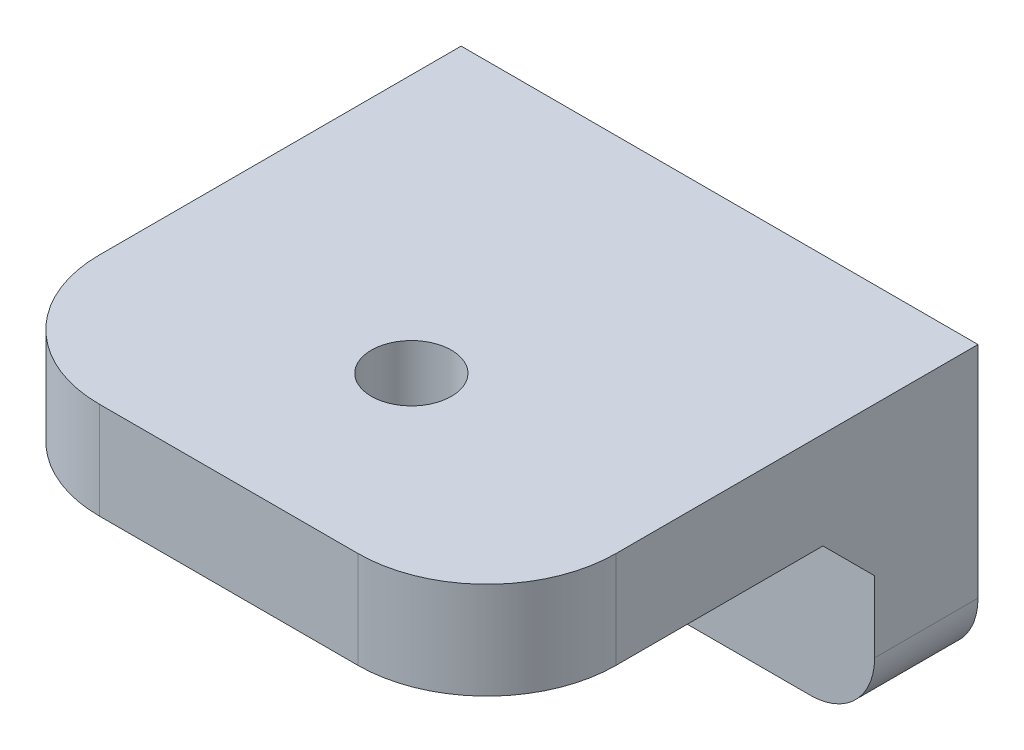
ISO-10303-21;
HEADER;
FILE_DESCRIPTION(('STEP AP214'),'2;1');
FILE_NAME('part.step','',(''),(''),'','','');
FILE_SCHEMA(('AUTOMOTIVE_DESIGN { 1 0 10303 214 1 1 1 1 }'));
ENDSEC;
DATA;
#1=APPLICATION_CONTEXT('core data for automotive mechanical design processes');
#2=APPLICATION_PROTOCOL_DEFINITION('international standard','automotive_design',2000,#1);
#3=PRODUCT_CONTEXT('',#1,'mechanical');
#4=PRODUCT('Part','Part','',(#3));
#5=PRODUCT_RELATED_PRODUCT_CATEGORY('part','',(#4));
#6=PRODUCT_DEFINITION_FORMATION('','',#4);
#7=PRODUCT_DEFINITION_CONTEXT('part definition',#1,'design');
#8=PRODUCT_DEFINITION('design','',#6,#7);
#9=PRODUCT_DEFINITION_SHAPE('','',#8);
#10=(LENGTH_UNIT() NAMED_UNIT(*) SI_UNIT(.MILLI.,.METRE.));
#11=(NAMED_UNIT(*) PLANE_ANGLE_UNIT() SI_UNIT($,.RADIAN.));
#12=(NAMED_UNIT(*) SI_UNIT($,.STERADIAN.) SOLID_ANGLE_UNIT());
#13=UNCERTAINTY_MEASURE_WITH_UNIT(LENGTH_MEASURE(1.E-05),#10,'distance_accuracy_value','');
#14=(GEOMETRIC_REPRESENTATION_CONTEXT(3) GLOBAL_UNCERTAINTY_ASSIGNED_CONTEXT((#13)) GLOBAL_UNIT_ASSIGNED_CONTEXT((#10,
#11,#12)) REPRESENTATION_CONTEXT('',''));
#15=CARTESIAN_POINT('',(0.,0.,0.));
#16=DIRECTION('',(0.,0.,1.));
#17=DIRECTION('',(1.,0.,0.));
#18=AXIS2_PLACEMENT_3D('',#15,#16,#17);
#19=CARTESIAN_POINT('',(-20.,-4.40647028298916,8.));
#20=DIRECTION('',(1.,0.,0.));
#21=DIRECTION('',(0.,1.,0.));
#22=AXIS2_PLACEMENT_3D('',#19,#20,#21);
#23=PLANE('',#22);
#24=DIRECTION('',(0.,-1.,0.));
#25=VECTOR('',#24,1.);
#26=CARTESIAN_POINT('',(-20.,-4.40647028298916,0.));
#27=LINE('',#26,#25);
#28=CARTESIAN_POINT('',(-20.,-4.40647028298916,0.));
#29=VERTEX_POINT('',#28);
#30=CARTESIAN_POINT('',(-20.,-21.4064702829892,0.));
#31=VERTEX_POINT('',#30);
#32=EDGE_CURVE('E148',#29,#31,#27,.T.);
#33=ORIENTED_EDGE('',*,*,#32,.T.);
#34=DIRECTION('',(0.,0.,-1.));
#35=VECTOR('',#34,1.);
#36=CARTESIAN_POINT('',(-20.,-21.4064702829892,8.));
#37=LINE('',#36,#35);
#38=CARTESIAN_POINT('',(-20.,-21.4064702829892,8.));
#39=VERTEX_POINT('',#38);
#40=EDGE_CURVE('E11',#31,#39,#37,.F.);
#41=ORIENTED_EDGE('',*,*,#40,.T.);
#42=DIRECTION('',(0.,-1.,0.));
#43=VECTOR('',#42,1.);
#44=CARTESIAN_POINT('',(-20.,-4.40647028298916,8.));
#45=LINE('',#44,#43);
#46=CARTESIAN_POINT('',(-20.,-15.9064702829891,8.));
#47=VERTEX_POINT('',#46);
#48=EDGE_CURVE('E149',#47,#39,#45,.T.);
#49=ORIENTED_EDGE('',*,*,#48,.F.);
#50=DIRECTION('',(0.,0.707106781186544,0.707106781186551));
#51=VECTOR('',#50,1.);
#52=CARTESIAN_POINT('',(-20.,-10.1564702829892,13.75));
#53=LINE('',#52,#51);
#54=CARTESIAN_POINT('',(-20.,-11.9064702829892,12.));
#55=VERTEX_POINT('',#54);
#56=EDGE_CURVE('E164',#47,#55,#53,.T.);
#57=ORIENTED_EDGE('',*,*,#56,.T.);
#58=DIRECTION('',(0.,0.,-1.));
#59=VECTOR('',#58,1.);
#60=CARTESIAN_POINT('',(-20.,-11.9064702829892,38.));
#61=LINE('',#60,#59);
#62=CARTESIAN_POINT('',(-20.,-11.9064702829892,28.));
#63=VERTEX_POINT('',#62);
#64=EDGE_CURVE('E206',#63,#55,#61,.T.);
#65=ORIENTED_EDGE('',*,*,#64,.F.);
#66=DIRECTION('',(0.,-1.,0.));
#67=VECTOR('',#66,1.);
#68=CARTESIAN_POINT('',(-20.,-4.40647028298916,28.));
#69=LINE('',#68,#67);
#70=CARTESIAN_POINT('',(-20.,-4.40647028298916,28.));
#71=VERTEX_POINT('',#70);
#72=EDGE_CURVE('E182',#63,#71,#69,.F.);
#73=ORIENTED_EDGE('',*,*,#72,.T.);
#74=DIRECTION('',(0.,0.,-1.));
#75=VECTOR('',#74,1.);
#76=CARTESIAN_POINT('',(-20.,-4.40647028298916,8.));
#77=LINE('',#76,#75);
#78=EDGE_CURVE('E145',#71,#29,#77,.T.);
#79=ORIENTED_EDGE('',*,*,#78,.T.);
#80=EDGE_LOOP('',(#33,#41,#49,#57,#65,#73,#79));
#81=FACE_BOUND('',#80,.T.);
#82=ADVANCED_FACE('F37',(#81),#23,.F.);
#83=CARTESIAN_POINT('',(-20.,-26.4064702829892,8.));
#84=DIRECTION('',(0.,1.,0.));
#85=DIRECTION('',(0.,0.,1.));
#86=AXIS2_PLACEMENT_3D('',#83,#84,#85);
#87=PLANE('',#86);
#88=DIRECTION('',(1.,0.,0.));
#89=VECTOR('',#88,1.);
#90=CARTESIAN_POINT('',(-20.,-26.4064702829892,0.));
#91=LINE('',#90,#89);
#92=CARTESIAN_POINT('',(-15.,-26.4064702829892,0.));
#93=VERTEX_POINT('',#92);
#94=CARTESIAN_POINT('',(15.,-26.4064702829892,0.));
#95=VERTEX_POINT('',#94);
#96=EDGE_CURVE('E135',#93,#95,#91,.T.);
#97=ORIENTED_EDGE('',*,*,#96,.T.);
#98=DIRECTION('',(0.,0.,-1.));
#99=VECTOR('',#98,1.);
#100=CARTESIAN_POINT('',(15.,-26.4064702829892,8.));
#101=LINE('',#100,#99);
#102=CARTESIAN_POINT('',(15.,-26.4064702829892,8.));
#103=VERTEX_POINT('',#102);
#104=EDGE_CURVE('E59',#95,#103,#101,.F.);
#105=ORIENTED_EDGE('',*,*,#104,.T.);
#106=DIRECTION('',(1.,0.,0.));
#107=VECTOR('',#106,1.);
#108=CARTESIAN_POINT('',(-20.,-26.4064702829892,8.));
#109=LINE('',#108,#107);
#110=CARTESIAN_POINT('',(-15.,-26.4064702829892,8.));
#111=VERTEX_POINT('',#110);
#112=EDGE_CURVE('E151',#111,#103,#109,.T.);
#113=ORIENTED_EDGE('',*,*,#112,.F.);
#114=DIRECTION('',(0.,0.,-1.));
#115=VECTOR('',#114,1.);
#116=CARTESIAN_POINT('',(-15.,-26.4064702829892,8.));
#117=LINE('',#116,#115);
#118=EDGE_CURVE('E189',#111,#93,#117,.T.);
#119=ORIENTED_EDGE('',*,*,#118,.T.);
#120=EDGE_LOOP('',(#97,#105,#113,#119));
#121=FACE_BOUND('',#120,.T.);
#122=ADVANCED_FACE('F204',(#121),#87,.F.);
#123=CARTESIAN_POINT('',(20.,-4.40647028298916,8.));
#124=DIRECTION('',(-1.,0.,0.));
#125=DIRECTION('',(0.,-1.,0.));
#126=AXIS2_PLACEMENT_3D('',#123,#124,#125);
#127=PLANE('',#126);
#128=DIRECTION('',(0.,1.,0.));
#129=VECTOR('',#128,1.);
#130=CARTESIAN_POINT('',(20.,-4.40647028298916,8.));
#131=LINE('',#130,#129);
#132=CARTESIAN_POINT('',(20.,-21.4064702829892,8.));
#133=VERTEX_POINT('',#132);
#134=CARTESIAN_POINT('',(20.,-15.9064702829891,8.));
#135=VERTEX_POINT('',#134);
#136=EDGE_CURVE('E155',#133,#135,#131,.T.);
#137=ORIENTED_EDGE('',*,*,#136,.F.);
#138=DIRECTION('',(0.,0.,-1.));
#139=VECTOR('',#138,1.);
#140=CARTESIAN_POINT('',(20.,-21.4064702829892,8.));
#141=LINE('',#140,#139);
#142=CARTESIAN_POINT('',(20.,-21.4064702829892,0.));
#143=VERTEX_POINT('',#142);
#144=EDGE_CURVE('E131',#133,#143,#141,.T.);
#145=ORIENTED_EDGE('',*,*,#144,.T.);
#146=DIRECTION('',(0.,1.,0.));
#147=VECTOR('',#146,1.);
#148=CARTESIAN_POINT('',(20.,-4.40647028298916,0.));
#149=LINE('',#148,#147);
#150=CARTESIAN_POINT('',(20.,-4.40647028298916,0.));
#151=VERTEX_POINT('',#150);
#152=EDGE_CURVE('E124',#143,#151,#149,.T.);
#153=ORIENTED_EDGE('',*,*,#152,.T.);
#154=DIRECTION('',(0.,0.,-1.));
#155=VECTOR('',#154,1.);
#156=CARTESIAN_POINT('',(20.,-4.40647028298916,8.));
#157=LINE('',#156,#155);
#158=CARTESIAN_POINT('',(20.,-4.40647028298916,28.));
#159=VERTEX_POINT('',#158);
#160=EDGE_CURVE('E128',#159,#151,#157,.T.);
#161=ORIENTED_EDGE('',*,*,#160,.F.);
#162=DIRECTION('',(0.,1.,0.));
#163=VECTOR('',#162,1.);
#164=CARTESIAN_POINT('',(20.,-11.9064702829892,28.));
#165=LINE('',#164,#163);
#166=CARTESIAN_POINT('',(20.,-11.9064702829892,28.));
#167=VERTEX_POINT('',#166);
#168=EDGE_CURVE('E176',#159,#167,#165,.F.);
#169=ORIENTED_EDGE('',*,*,#168,.T.);
#170=DIRECTION('',(0.,0.,-1.));
#171=VECTOR('',#170,1.);
#172=CARTESIAN_POINT('',(20.,-11.9064702829892,38.));
#173=LINE('',#172,#171);
#174=CARTESIAN_POINT('',(20.,-11.9064702829892,12.));
#175=VERTEX_POINT('',#174);
#176=EDGE_CURVE('E211',#167,#175,#173,.T.);
#177=ORIENTED_EDGE('',*,*,#176,.T.);
#178=DIRECTION('',(0.,-0.707106781186544,-0.707106781186551));
#179=VECTOR('',#178,1.);
#180=CARTESIAN_POINT('',(20.,-10.1564702829892,13.75));
#181=LINE('',#180,#179);
#182=EDGE_CURVE('E161',#175,#135,#181,.T.);
#183=ORIENTED_EDGE('',*,*,#182,.T.);
#184=EDGE_LOOP('',(#137,#145,#153,#161,#169,#177,#183));
#185=FACE_BOUND('',#184,.T.);
#186=ADVANCED_FACE('F127',(#185),#127,.F.);
#187=CARTESIAN_POINT('',(-20.,-4.40647028298916,8.));
#188=DIRECTION('',(0.,-1.,0.));
#189=DIRECTION('',(0.,0.,-1.));
#190=AXIS2_PLACEMENT_3D('',#187,#188,#189);
#191=PLANE('',#190);
#192=CARTESIAN_POINT('',(0.,-4.40647028298916,23.8517917694704));
#193=DIRECTION('',(0.,1.,0.));
#194=DIRECTION('',(0.,0.,1.));
#195=AXIS2_PLACEMENT_3D('',#192,#193,#194);
#196=CIRCLE('',#195,3.1);
#197=CARTESIAN_POINT('',(0.,-4.40647028298916,26.9517917694704));
#198=VERTEX_POINT('',#197);
#199=EDGE_CURVE('E219',#198,#198,#196,.T.);
#200=ORIENTED_EDGE('',*,*,#199,.F.);
#201=EDGE_LOOP('',(#200));
#202=FACE_BOUND('',#201,.T.);
#203=DIRECTION('',(-1.,0.,0.));
#204=VECTOR('',#203,1.);
#205=CARTESIAN_POINT('',(-20.,-4.40647028298916,38.));
#206=LINE('',#205,#204);
#207=CARTESIAN_POINT('',(10.,-4.40647028298916,38.));
#208=VERTEX_POINT('',#207);
#209=CARTESIAN_POINT('',(-10.,-4.40647028298916,38.));
#210=VERTEX_POINT('',#209);
#211=EDGE_CURVE('E213',#208,#210,#206,.T.);
#212=ORIENTED_EDGE('',*,*,#211,.F.);
#213=CARTESIAN_POINT('',(10.,-4.40647028298916,28.));
#214=DIRECTION('',(0.,-1.,0.));
#215=DIRECTION('',(0.,0.,-1.));
#216=AXIS2_PLACEMENT_3D('',#213,#214,#215);
#217=CIRCLE('',#216,10.);
#218=EDGE_CURVE('E143',#208,#159,#217,.F.);
#219=ORIENTED_EDGE('',*,*,#218,.T.);
#220=ORIENTED_EDGE('',*,*,#160,.T.);
#221=DIRECTION('',(-1.,0.,0.));
#222=VECTOR('',#221,1.);
#223=CARTESIAN_POINT('',(-20.,-4.40647028298916,0.));
#224=LINE('',#223,#222);
#225=EDGE_CURVE('E134',#151,#29,#224,.T.);
#226=ORIENTED_EDGE('',*,*,#225,.T.);
#227=ORIENTED_EDGE('',*,*,#78,.F.);
#228=CARTESIAN_POINT('',(-10.,-4.40647028298916,28.));
#229=DIRECTION('',(0.,-1.,0.));
#230=DIRECTION('',(0.,0.,-1.));
#231=AXIS2_PLACEMENT_3D('',#228,#229,#230);
#232=CIRCLE('',#231,10.);
#233=EDGE_CURVE('E173',#71,#210,#232,.F.);
#234=ORIENTED_EDGE('',*,*,#233,.T.);
#235=EDGE_LOOP('',(#212,#219,#220,#226,#227,#234));
#236=FACE_BOUND('',#235,.T.);
#237=ADVANCED_FACE('F140',(#202,#236),#191,.F.);
#238=CARTESIAN_POINT('',(0.,0.,8.));
#239=DIRECTION('',(0.,0.,1.));
#240=DIRECTION('',(1.,0.,0.));
#241=AXIS2_PLACEMENT_3D('',#238,#239,#240);
#242=PLANE('',#241);
#243=ORIENTED_EDGE('',*,*,#112,.T.);
#244=CARTESIAN_POINT('',(15.,-21.4064702829892,8.));
#245=DIRECTION('',(0.,0.,1.));
#246=DIRECTION('',(1.,0.,0.));
#247=AXIS2_PLACEMENT_3D('',#244,#245,#246);
#248=CIRCLE('',#247,5.);
#249=EDGE_CURVE('E46',#103,#133,#248,.T.);
#250=ORIENTED_EDGE('',*,*,#249,.T.);
#251=ORIENTED_EDGE('',*,*,#136,.T.);
#252=DIRECTION('',(-1.,0.,0.));
#253=VECTOR('',#252,1.);
#254=CARTESIAN_POINT('',(0.,-15.9064702829891,8.));
#255=LINE('',#254,#253);
#256=EDGE_CURVE('E159',#135,#47,#255,.T.);
#257=ORIENTED_EDGE('',*,*,#256,.T.);
#258=ORIENTED_EDGE('',*,*,#48,.T.);
#259=CARTESIAN_POINT('',(-15.,-21.4064702829892,8.));
#260=DIRECTION('',(0.,0.,1.));
#261=DIRECTION('',(1.,0.,0.));
#262=AXIS2_PLACEMENT_3D('',#259,#260,#261);
#263=CIRCLE('',#262,5.);
#264=EDGE_CURVE('E193',#39,#111,#263,.T.);
#265=ORIENTED_EDGE('',*,*,#264,.T.);
#266=EDGE_LOOP('',(#243,#250,#251,#257,#258,#265));
#267=FACE_BOUND('',#266,.T.);
#268=ADVANCED_FACE('F197',(#267),#242,.T.);
#269=CARTESIAN_POINT('',(0.,0.,0.));
#270=DIRECTION('',(0.,0.,1.));
#271=DIRECTION('',(1.,0.,0.));
#272=AXIS2_PLACEMENT_3D('',#269,#270,#271);
#273=PLANE('',#272);
#274=ORIENTED_EDGE('',*,*,#152,.F.);
#275=CARTESIAN_POINT('',(15.,-21.4064702829892,0.));
#276=DIRECTION('',(0.,0.,1.));
#277=DIRECTION('',(1.,0.,0.));
#278=AXIS2_PLACEMENT_3D('',#275,#276,#277);
#279=CIRCLE('',#278,5.);
#280=EDGE_CURVE('E187',#143,#95,#279,.F.);
#281=ORIENTED_EDGE('',*,*,#280,.T.);
#282=ORIENTED_EDGE('',*,*,#96,.F.);
#283=CARTESIAN_POINT('',(-15.,-21.4064702829892,0.));
#284=DIRECTION('',(0.,0.,1.));
#285=DIRECTION('',(1.,0.,0.));
#286=AXIS2_PLACEMENT_3D('',#283,#284,#285);
#287=CIRCLE('',#286,5.);
#288=EDGE_CURVE('E185',#93,#31,#287,.F.);
#289=ORIENTED_EDGE('',*,*,#288,.T.);
#290=ORIENTED_EDGE('',*,*,#32,.F.);
#291=ORIENTED_EDGE('',*,*,#225,.F.);
#292=EDGE_LOOP('',(#274,#281,#282,#289,#290,#291));
#293=FACE_BOUND('',#292,.T.);
#294=ADVANCED_FACE('F147',(#293),#273,.F.);
#295=CARTESIAN_POINT('',(-20.,-11.9064702829892,38.));
#296=DIRECTION('',(0.,1.,0.));
#297=DIRECTION('',(0.,0.,1.));
#298=AXIS2_PLACEMENT_3D('',#295,#296,#297);
#299=PLANE('',#298);
#300=CARTESIAN_POINT('',(0.,-11.9064702829892,23.8517917694704));
#301=DIRECTION('',(0.,1.,0.));
#302=DIRECTION('',(0.,0.,1.));
#303=AXIS2_PLACEMENT_3D('',#300,#301,#302);
#304=CIRCLE('',#303,3.1);
#305=CARTESIAN_POINT('',(0.,-11.9064702829892,26.9517917694704));
#306=VERTEX_POINT('',#305);
#307=EDGE_CURVE('E41',#306,#306,#304,.T.);
#308=ORIENTED_EDGE('',*,*,#307,.T.);
#309=EDGE_LOOP('',(#308));
#310=FACE_BOUND('',#309,.T.);
#311=ORIENTED_EDGE('',*,*,#176,.F.);
#312=CARTESIAN_POINT('',(10.,-11.9064702829892,28.));
#313=DIRECTION('',(0.,1.,0.));
#314=DIRECTION('',(0.,0.,1.));
#315=AXIS2_PLACEMENT_3D('',#312,#313,#314);
#316=CIRCLE('',#315,10.);
#317=CARTESIAN_POINT('',(10.,-11.9064702829892,38.));
#318=VERTEX_POINT('',#317);
#319=EDGE_CURVE('E180',#167,#318,#316,.F.);
#320=ORIENTED_EDGE('',*,*,#319,.T.);
#321=DIRECTION('',(1.,0.,0.));
#322=VECTOR('',#321,1.);
#323=CARTESIAN_POINT('',(-20.,-11.9064702829892,38.));
#324=LINE('',#323,#322);
#325=CARTESIAN_POINT('',(-10.,-11.9064702829892,38.));
#326=VERTEX_POINT('',#325);
#327=EDGE_CURVE('E216',#326,#318,#324,.T.);
#328=ORIENTED_EDGE('',*,*,#327,.F.);
#329=CARTESIAN_POINT('',(-10.,-11.9064702829892,28.));
#330=DIRECTION('',(0.,1.,0.));
#331=DIRECTION('',(0.,0.,1.));
#332=AXIS2_PLACEMENT_3D('',#329,#330,#331);
#333=CIRCLE('',#332,10.);
#334=EDGE_CURVE('E178',#326,#63,#333,.F.);
#335=ORIENTED_EDGE('',*,*,#334,.T.);
#336=ORIENTED_EDGE('',*,*,#64,.T.);
#337=DIRECTION('',(1.,0.,0.));
#338=VECTOR('',#337,1.);
#339=CARTESIAN_POINT('',(-20.,-11.9064702829892,12.));
#340=LINE('',#339,#338);
#341=EDGE_CURVE('E144',#55,#175,#340,.T.);
#342=ORIENTED_EDGE('',*,*,#341,.T.);
#343=EDGE_LOOP('',(#311,#320,#328,#335,#336,#342));
#344=FACE_BOUND('',#343,.T.);
#345=ADVANCED_FACE('F226',(#310,#344),#299,.F.);
#346=CARTESIAN_POINT('',(0.,0.,38.));
#347=DIRECTION('',(0.,0.,1.));
#348=DIRECTION('',(1.,0.,0.));
#349=AXIS2_PLACEMENT_3D('',#346,#347,#348);
#350=PLANE('',#349);
#351=ORIENTED_EDGE('',*,*,#327,.T.);
#352=DIRECTION('',(0.,1.,0.));
#353=VECTOR('',#352,1.);
#354=CARTESIAN_POINT('',(10.,-4.40647028298915,38.));
#355=LINE('',#354,#353);
#356=EDGE_CURVE('E170',#318,#208,#355,.T.);
#357=ORIENTED_EDGE('',*,*,#356,.T.);
#358=ORIENTED_EDGE('',*,*,#211,.T.);
#359=DIRECTION('',(0.,-1.,0.));
#360=VECTOR('',#359,1.);
#361=CARTESIAN_POINT('',(-10.,-11.9064702829892,38.));
#362=LINE('',#361,#360);
#363=EDGE_CURVE('E167',#210,#326,#362,.T.);
#364=ORIENTED_EDGE('',*,*,#363,.T.);
#365=EDGE_LOOP('',(#351,#357,#358,#364));
#366=FACE_BOUND('',#365,.T.);
#367=ADVANCED_FACE('F252',(#366),#350,.T.);
#368=CARTESIAN_POINT('',(-20.,-11.9064702829892,12.));
#369=DIRECTION('',(0.,0.70710678118655,-0.707106781186544));
#370=DIRECTION('',(1.,0.,0.));
#371=AXIS2_PLACEMENT_3D('',#368,#369,#370);
#372=PLANE('',#371);
#373=ORIENTED_EDGE('',*,*,#56,.F.);
#374=ORIENTED_EDGE('',*,*,#256,.F.);
#375=ORIENTED_EDGE('',*,*,#182,.F.);
#376=ORIENTED_EDGE('',*,*,#341,.F.);
#377=EDGE_LOOP('',(#373,#374,#375,#376));
#378=FACE_BOUND('',#377,.T.);
#379=ADVANCED_FACE('F246',(#378),#372,.F.);
#380=CARTESIAN_POINT('',(10.,0.,28.));
#381=DIRECTION('',(0.,-1.,0.));
#382=DIRECTION('',(1.,0.,0.));
#383=AXIS2_PLACEMENT_3D('',#380,#381,#382);
#384=CYLINDRICAL_SURFACE('',#383,10.);
#385=ORIENTED_EDGE('',*,*,#319,.F.);
#386=ORIENTED_EDGE('',*,*,#168,.F.);
#387=ORIENTED_EDGE('',*,*,#218,.F.);
#388=ORIENTED_EDGE('',*,*,#356,.F.);
#389=EDGE_LOOP('',(#385,#386,#387,#388));
#390=FACE_BOUND('',#389,.T.);
#391=ADVANCED_FACE('F251',(#390),#384,.T.);
#392=CARTESIAN_POINT('',(-10.,0.,28.));
#393=DIRECTION('',(0.,1.,0.));
#394=DIRECTION('',(-1.,0.,0.));
#395=AXIS2_PLACEMENT_3D('',#392,#393,#394);
#396=CYLINDRICAL_SURFACE('',#395,10.);
#397=ORIENTED_EDGE('',*,*,#233,.F.);
#398=ORIENTED_EDGE('',*,*,#72,.F.);
#399=ORIENTED_EDGE('',*,*,#334,.F.);
#400=ORIENTED_EDGE('',*,*,#363,.F.);
#401=EDGE_LOOP('',(#397,#398,#399,#400));
#402=FACE_BOUND('',#401,.T.);
#403=ADVANCED_FACE('F256',(#402),#396,.T.);
#404=CARTESIAN_POINT('',(15.,-21.4064702829892,8.));
#405=DIRECTION('',(0.,0.,-1.));
#406=DIRECTION('',(-1.,0.,0.));
#407=AXIS2_PLACEMENT_3D('',#404,#405,#406);
#408=CYLINDRICAL_SURFACE('',#407,5.);
#409=ORIENTED_EDGE('',*,*,#249,.F.);
#410=ORIENTED_EDGE('',*,*,#104,.F.);
#411=ORIENTED_EDGE('',*,*,#280,.F.);
#412=ORIENTED_EDGE('',*,*,#144,.F.);
#413=EDGE_LOOP('',(#409,#410,#411,#412));
#414=FACE_BOUND('',#413,.T.);
#415=ADVANCED_FACE('F202',(#414),#408,.T.);
#416=CARTESIAN_POINT('',(-15.,-21.4064702829892,8.));
#417=DIRECTION('',(0.,0.,-1.));
#418=DIRECTION('',(-1.,0.,0.));
#419=AXIS2_PLACEMENT_3D('',#416,#417,#418);
#420=CYLINDRICAL_SURFACE('',#419,5.);
#421=ORIENTED_EDGE('',*,*,#264,.F.);
#422=ORIENTED_EDGE('',*,*,#40,.F.);
#423=ORIENTED_EDGE('',*,*,#288,.F.);
#424=ORIENTED_EDGE('',*,*,#118,.F.);
#425=EDGE_LOOP('',(#421,#422,#423,#424));
#426=FACE_BOUND('',#425,.T.);
#427=ADVANCED_FACE('F39',(#426),#420,.T.);
#428=CARTESIAN_POINT('',(0.,-26.4064702829892,23.8517917694704));
#429=DIRECTION('',(0.,1.,0.));
#430=DIRECTION('',(0.,0.,1.));
#431=AXIS2_PLACEMENT_3D('',#428,#429,#430);
#432=CYLINDRICAL_SURFACE('',#431,3.1);
#433=ORIENTED_EDGE('',*,*,#199,.T.);
#434=EDGE_LOOP('',(#433));
#435=FACE_BOUND('',#434,.T.);
#436=ORIENTED_EDGE('',*,*,#307,.F.);
#437=EDGE_LOOP('',(#436));
#438=FACE_BOUND('',#437,.T.);
#439=ADVANCED_FACE('F229',(#435,#438),#432,.F.);
#440=CLOSED_SHELL('',(#82,#122,#186,#237,#268,#294,#345,#367,#379,#391,#403,#415,#427,#439));
#441=MANIFOLD_SOLID_BREP('B2',#440);
#442=ADVANCED_BREP_SHAPE_REPRESENTATION('',(#18,#441),#14);
#443=SHAPE_DEFINITION_REPRESENTATION(#9,#442);
ENDSEC;
END-ISO-10303-21;
